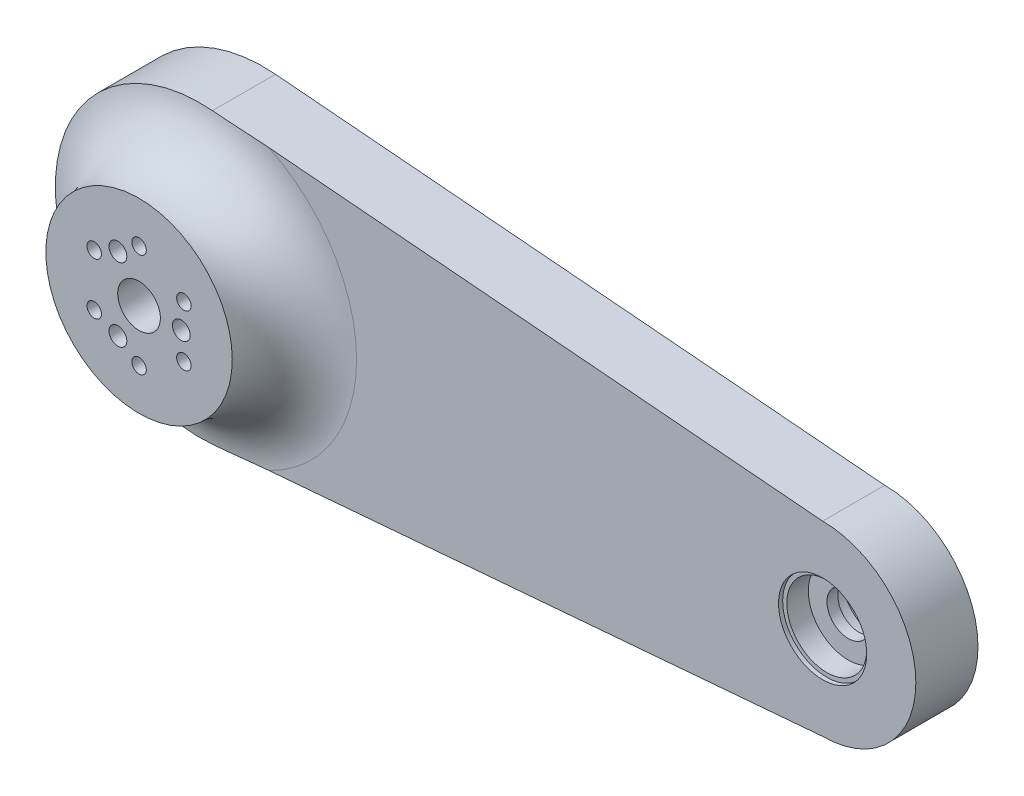
ISO-10303-21;
HEADER;
FILE_DESCRIPTION(('STEP AP214'),'2;1');
FILE_NAME('part.step','',(''),(''),'','','');
FILE_SCHEMA(('AUTOMOTIVE_DESIGN { 1 0 10303 214 1 1 1 1 }'));
ENDSEC;
DATA;
#1=APPLICATION_CONTEXT('core data for automotive mechanical design processes');
#2=APPLICATION_PROTOCOL_DEFINITION('international standard','automotive_design',2000,#1);
#3=PRODUCT_CONTEXT('',#1,'mechanical');
#4=PRODUCT('Part','Part','',(#3));
#5=PRODUCT_RELATED_PRODUCT_CATEGORY('part','',(#4));
#6=PRODUCT_DEFINITION_FORMATION('','',#4);
#7=PRODUCT_DEFINITION_CONTEXT('part definition',#1,'design');
#8=PRODUCT_DEFINITION('design','',#6,#7);
#9=PRODUCT_DEFINITION_SHAPE('','',#8);
#10=(LENGTH_UNIT() NAMED_UNIT(*) SI_UNIT(.MILLI.,.METRE.));
#11=(NAMED_UNIT(*) PLANE_ANGLE_UNIT() SI_UNIT($,.RADIAN.));
#12=(NAMED_UNIT(*) SI_UNIT($,.STERADIAN.) SOLID_ANGLE_UNIT());
#13=UNCERTAINTY_MEASURE_WITH_UNIT(LENGTH_MEASURE(1.E-05),#10,'distance_accuracy_value','');
#14=(GEOMETRIC_REPRESENTATION_CONTEXT(3) GLOBAL_UNCERTAINTY_ASSIGNED_CONTEXT((#13)) GLOBAL_UNIT_ASSIGNED_CONTEXT((#10,
#11,#12)) REPRESENTATION_CONTEXT('',''));
#15=CARTESIAN_POINT('',(0.,0.,0.));
#16=DIRECTION('',(0.,0.,1.));
#17=DIRECTION('',(1.,0.,0.));
#18=AXIS2_PLACEMENT_3D('',#15,#16,#17);
#19=CARTESIAN_POINT('',(0.,0.,30.));
#20=DIRECTION('',(0.,0.,1.));
#21=DIRECTION('',(1.,0.,0.));
#22=AXIS2_PLACEMENT_3D('',#19,#20,#21);
#23=PLANE('',#22);
#24=CARTESIAN_POINT('',(-5.1,-8.833459118601,30.));
#25=DIRECTION('',(0.,0.,-1.));
#26=DIRECTION('',(-1.,0.,0.));
#27=AXIS2_PLACEMENT_3D('',#24,#25,#26);
#28=CIRCLE('',#27,2.15000000000001);
#29=CARTESIAN_POINT('',(-7.25000000000001,-8.833459118601,30.));
#30=VERTEX_POINT('',#29);
#31=EDGE_CURVE('E835',#30,#30,#28,.T.);
#32=ORIENTED_EDGE('',*,*,#31,.T.);
#33=EDGE_LOOP('',(#32));
#34=FACE_BOUND('',#33,.T.);
#35=CARTESIAN_POINT('',(0.,0.,30.));
#36=DIRECTION('',(0.,0.,1.));
#37=DIRECTION('',(1.,0.,0.));
#38=AXIS2_PLACEMENT_3D('',#35,#36,#37);
#39=CIRCLE('',#38,22.49999999897);
#40=CARTESIAN_POINT('',(22.49999999897,0.,30.));
#41=VERTEX_POINT('',#40);
#42=EDGE_CURVE('E166',#41,#41,#39,.T.);
#43=ORIENTED_EDGE('',*,*,#42,.T.);
#44=EDGE_LOOP('',(#43));
#45=FACE_BOUND('',#44,.T.);
#46=CARTESIAN_POINT('',(0.,0.,30.));
#47=DIRECTION('',(0.,0.,1.));
#48=DIRECTION('',(1.,0.,0.));
#49=AXIS2_PLACEMENT_3D('',#46,#47,#48);
#50=CIRCLE('',#49,5.15000000000001);
#51=CARTESIAN_POINT('',(5.15000000000001,0.,30.));
#52=VERTEX_POINT('',#51);
#53=EDGE_CURVE('E926',#52,#52,#50,.T.);
#54=ORIENTED_EDGE('',*,*,#53,.F.);
#55=EDGE_LOOP('',(#54));
#56=FACE_BOUND('',#55,.T.);
#57=CARTESIAN_POINT('',(0.,-12.5,30.));
#58=DIRECTION('',(0.,0.,-1.));
#59=DIRECTION('',(-1.,0.,0.));
#60=AXIS2_PLACEMENT_3D('',#57,#58,#59);
#61=CIRCLE('',#60,1.75000000000001);
#62=CARTESIAN_POINT('',(-1.75000000000001,-12.5,30.));
#63=VERTEX_POINT('',#62);
#64=EDGE_CURVE('E923',#63,#63,#61,.T.);
#65=ORIENTED_EDGE('',*,*,#64,.T.);
#66=EDGE_LOOP('',(#65));
#67=FACE_BOUND('',#66,.T.);
#68=CARTESIAN_POINT('',(-10.82531754731,-6.25,30.));
#69=DIRECTION('',(0.,0.,-1.));
#70=DIRECTION('',(-1.,0.,0.));
#71=AXIS2_PLACEMENT_3D('',#68,#69,#70);
#72=CIRCLE('',#71,1.75000000000001);
#73=CARTESIAN_POINT('',(-12.57531754731,-6.25,30.));
#74=VERTEX_POINT('',#73);
#75=EDGE_CURVE('E911',#74,#74,#72,.T.);
#76=ORIENTED_EDGE('',*,*,#75,.T.);
#77=EDGE_LOOP('',(#76));
#78=FACE_BOUND('',#77,.T.);
#79=CARTESIAN_POINT('',(10.82531754731,-6.25,30.));
#80=DIRECTION('',(0.,0.,-1.));
#81=DIRECTION('',(-1.,0.,0.));
#82=AXIS2_PLACEMENT_3D('',#79,#80,#81);
#83=CIRCLE('',#82,1.75000000000001);
#84=CARTESIAN_POINT('',(9.07531754730999,-6.25,30.));
#85=VERTEX_POINT('',#84);
#86=EDGE_CURVE('E899',#85,#85,#83,.T.);
#87=ORIENTED_EDGE('',*,*,#86,.T.);
#88=EDGE_LOOP('',(#87));
#89=FACE_BOUND('',#88,.T.);
#90=CARTESIAN_POINT('',(10.82531754731,6.25,30.));
#91=DIRECTION('',(0.,0.,-1.));
#92=DIRECTION('',(-1.,0.,0.));
#93=AXIS2_PLACEMENT_3D('',#90,#91,#92);
#94=CIRCLE('',#93,1.75000000000001);
#95=CARTESIAN_POINT('',(9.07531754730999,6.25,30.));
#96=VERTEX_POINT('',#95);
#97=EDGE_CURVE('E887',#96,#96,#94,.T.);
#98=ORIENTED_EDGE('',*,*,#97,.T.);
#99=EDGE_LOOP('',(#98));
#100=FACE_BOUND('',#99,.T.);
#101=CARTESIAN_POINT('',(0.,12.5,30.));
#102=DIRECTION('',(0.,0.,-1.));
#103=DIRECTION('',(-1.,0.,0.));
#104=AXIS2_PLACEMENT_3D('',#101,#102,#103);
#105=CIRCLE('',#104,1.75000000000001);
#106=CARTESIAN_POINT('',(-1.75000000000001,12.5,30.));
#107=VERTEX_POINT('',#106);
#108=EDGE_CURVE('E875',#107,#107,#105,.T.);
#109=ORIENTED_EDGE('',*,*,#108,.T.);
#110=EDGE_LOOP('',(#109));
#111=FACE_BOUND('',#110,.T.);
#112=CARTESIAN_POINT('',(-10.82531754731,6.25,30.));
#113=DIRECTION('',(0.,0.,-1.));
#114=DIRECTION('',(-1.,0.,0.));
#115=AXIS2_PLACEMENT_3D('',#112,#113,#114);
#116=CIRCLE('',#115,1.75000000000001);
#117=CARTESIAN_POINT('',(-12.57531754731,6.25,30.));
#118=VERTEX_POINT('',#117);
#119=EDGE_CURVE('E863',#118,#118,#116,.T.);
#120=ORIENTED_EDGE('',*,*,#119,.T.);
#121=EDGE_LOOP('',(#120));
#122=FACE_BOUND('',#121,.T.);
#123=CARTESIAN_POINT('',(-5.1,8.833459118601,30.));
#124=DIRECTION('',(0.,0.,-1.));
#125=DIRECTION('',(-1.,0.,0.));
#126=AXIS2_PLACEMENT_3D('',#123,#124,#125);
#127=CIRCLE('',#126,2.15000000000001);
#128=CARTESIAN_POINT('',(-7.25000000000001,8.833459118601,30.));
#129=VERTEX_POINT('',#128);
#130=EDGE_CURVE('E851',#129,#129,#127,.T.);
#131=ORIENTED_EDGE('',*,*,#130,.T.);
#132=EDGE_LOOP('',(#131));
#133=FACE_BOUND('',#132,.T.);
#134=CARTESIAN_POINT('',(10.2,0.,30.));
#135=DIRECTION('',(0.,0.,-1.));
#136=DIRECTION('',(-1.,0.,0.));
#137=AXIS2_PLACEMENT_3D('',#134,#135,#136);
#138=CIRCLE('',#137,2.15000000000001);
#139=CARTESIAN_POINT('',(8.04999999999999,0.,30.));
#140=VERTEX_POINT('',#139);
#141=EDGE_CURVE('E845',#140,#140,#138,.T.);
#142=ORIENTED_EDGE('',*,*,#141,.T.);
#143=EDGE_LOOP('',(#142));
#144=FACE_BOUND('',#143,.T.);
#145=ADVANCED_FACE('F43',(#34,#45,#56,#67,#78,#89,#100,#111,#122,#133,#144),#23,.T.);
#146=CARTESIAN_POINT('',(0.,0.,0.));
#147=DIRECTION('',(0.,0.,1.));
#148=DIRECTION('',(1.,0.,0.));
#149=AXIS2_PLACEMENT_3D('',#146,#147,#148);
#150=PLANE('',#149);
#151=CARTESIAN_POINT('',(-5.1,-8.833459118601,0.));
#152=DIRECTION('',(0.,0.,-1.));
#153=DIRECTION('',(-1.,0.,0.));
#154=AXIS2_PLACEMENT_3D('',#151,#152,#153);
#155=CIRCLE('',#154,2.15000000000001);
#156=CARTESIAN_POINT('',(-7.25000000000002,-8.833459118601,0.));
#157=VERTEX_POINT('',#156);
#158=EDGE_CURVE('E838',#157,#157,#155,.T.);
#159=ORIENTED_EDGE('',*,*,#158,.F.);
#160=EDGE_LOOP('',(#159));
#161=FACE_BOUND('',#160,.T.);
#162=CARTESIAN_POINT('',(10.2,0.,0.));
#163=DIRECTION('',(0.,0.,-1.));
#164=DIRECTION('',(-1.,0.,0.));
#165=AXIS2_PLACEMENT_3D('',#162,#163,#164);
#166=CIRCLE('',#165,2.15000000000001);
#167=CARTESIAN_POINT('',(8.04999999999999,0.,0.));
#168=VERTEX_POINT('',#167);
#169=EDGE_CURVE('E840',#168,#168,#166,.T.);
#170=ORIENTED_EDGE('',*,*,#169,.F.);
#171=EDGE_LOOP('',(#170));
#172=FACE_BOUND('',#171,.T.);
#173=CARTESIAN_POINT('',(-5.1,8.833459118601,0.));
#174=DIRECTION('',(0.,0.,-1.));
#175=DIRECTION('',(-1.,0.,0.));
#176=AXIS2_PLACEMENT_3D('',#173,#174,#175);
#177=CIRCLE('',#176,2.15000000000001);
#178=CARTESIAN_POINT('',(-7.25000000000002,8.833459118601,0.));
#179=VERTEX_POINT('',#178);
#180=EDGE_CURVE('E848',#179,#179,#177,.T.);
#181=ORIENTED_EDGE('',*,*,#180,.F.);
#182=EDGE_LOOP('',(#181));
#183=FACE_BOUND('',#182,.T.);
#184=CARTESIAN_POINT('',(-10.82531754731,6.25,0.));
#185=DIRECTION('',(0.,0.,-1.));
#186=DIRECTION('',(-1.,0.,0.));
#187=AXIS2_PLACEMENT_3D('',#184,#185,#186);
#188=CIRCLE('',#187,3.25000000000001);
#189=CARTESIAN_POINT('',(-14.07531754731,6.25,0.));
#190=VERTEX_POINT('',#189);
#191=EDGE_CURVE('E854',#190,#190,#188,.T.);
#192=ORIENTED_EDGE('',*,*,#191,.F.);
#193=EDGE_LOOP('',(#192));
#194=FACE_BOUND('',#193,.T.);
#195=CARTESIAN_POINT('',(0.,12.5,0.));
#196=DIRECTION('',(0.,0.,-1.));
#197=DIRECTION('',(-1.,0.,0.));
#198=AXIS2_PLACEMENT_3D('',#195,#196,#197);
#199=CIRCLE('',#198,3.25000000000001);
#200=CARTESIAN_POINT('',(-3.25000000000001,12.5,0.));
#201=VERTEX_POINT('',#200);
#202=EDGE_CURVE('E866',#201,#201,#199,.T.);
#203=ORIENTED_EDGE('',*,*,#202,.F.);
#204=EDGE_LOOP('',(#203));
#205=FACE_BOUND('',#204,.T.);
#206=CARTESIAN_POINT('',(10.82531754731,6.25,0.));
#207=DIRECTION('',(0.,0.,-1.));
#208=DIRECTION('',(-1.,0.,0.));
#209=AXIS2_PLACEMENT_3D('',#206,#207,#208);
#210=CIRCLE('',#209,3.25000000000001);
#211=CARTESIAN_POINT('',(7.57531754730999,6.25,0.));
#212=VERTEX_POINT('',#211);
#213=EDGE_CURVE('E878',#212,#212,#210,.T.);
#214=ORIENTED_EDGE('',*,*,#213,.F.);
#215=EDGE_LOOP('',(#214));
#216=FACE_BOUND('',#215,.T.);
#217=CARTESIAN_POINT('',(10.82531754731,-6.25,0.));
#218=DIRECTION('',(0.,0.,-1.));
#219=DIRECTION('',(-1.,0.,0.));
#220=AXIS2_PLACEMENT_3D('',#217,#218,#219);
#221=CIRCLE('',#220,3.25000000000001);
#222=CARTESIAN_POINT('',(7.57531754730999,-6.25,0.));
#223=VERTEX_POINT('',#222);
#224=EDGE_CURVE('E890',#223,#223,#221,.T.);
#225=ORIENTED_EDGE('',*,*,#224,.F.);
#226=EDGE_LOOP('',(#225));
#227=FACE_BOUND('',#226,.T.);
#228=CARTESIAN_POINT('',(-10.82531754731,-6.25,0.));
#229=DIRECTION('',(0.,0.,-1.));
#230=DIRECTION('',(-1.,0.,0.));
#231=AXIS2_PLACEMENT_3D('',#228,#229,#230);
#232=CIRCLE('',#231,3.25000000000001);
#233=CARTESIAN_POINT('',(-14.07531754731,-6.25,0.));
#234=VERTEX_POINT('',#233);
#235=EDGE_CURVE('E902',#234,#234,#232,.T.);
#236=ORIENTED_EDGE('',*,*,#235,.F.);
#237=EDGE_LOOP('',(#236));
#238=FACE_BOUND('',#237,.T.);
#239=CARTESIAN_POINT('',(0.,0.,0.));
#240=DIRECTION('',(0.,0.,1.));
#241=DIRECTION('',(1.,0.,0.));
#242=AXIS2_PLACEMENT_3D('',#239,#240,#241);
#243=CIRCLE('',#242,5.15000000000001);
#244=CARTESIAN_POINT('',(5.15000000000001,0.,0.));
#245=VERTEX_POINT('',#244);
#246=EDGE_CURVE('E929',#245,#245,#243,.T.);
#247=ORIENTED_EDGE('',*,*,#246,.T.);
#248=EDGE_LOOP('',(#247));
#249=FACE_BOUND('',#248,.T.);
#250=CARTESIAN_POINT('',(150.,0.,0.));
#251=DIRECTION('',(0.,0.,-1.));
#252=DIRECTION('',(-1.,0.,0.));
#253=AXIS2_PLACEMENT_3D('',#250,#251,#252);
#254=CIRCLE('',#253,10.65);
#255=CARTESIAN_POINT('',(139.35,0.,0.));
#256=VERTEX_POINT('',#255);
#257=EDGE_CURVE('E955',#256,#256,#254,.T.);
#258=ORIENTED_EDGE('',*,*,#257,.F.);
#259=EDGE_LOOP('',(#258));
#260=FACE_BOUND('',#259,.T.);
#261=CARTESIAN_POINT('',(0.,0.,0.));
#262=DIRECTION('',(0.,0.,-1.));
#263=DIRECTION('',(1.,0.,0.));
#264=AXIS2_PLACEMENT_3D('',#261,#262,#263);
#265=CIRCLE('',#264,34.9999999999974);
#266=CARTESIAN_POINT('',(2.9351603096,-34.87670904711,0.));
#267=VERTEX_POINT('',#266);
#268=CARTESIAN_POINT('',(2.9351603096,34.87670904711,0.));
#269=VERTEX_POINT('',#268);
#270=EDGE_CURVE('E105',#267,#269,#265,.T.);
#271=ORIENTED_EDGE('',*,*,#270,.T.);
#272=DIRECTION('',(0.996477401346075,-0.083861723131435,0.));
#273=VECTOR('',#272,1.);
#274=CARTESIAN_POINT('',(149.999999999946,22.5,0.));
#275=LINE('',#274,#273);
#276=CARTESIAN_POINT('',(149.999999999946,22.5,0.));
#277=VERTEX_POINT('',#276);
#278=EDGE_CURVE('E111',#269,#277,#275,.T.);
#279=ORIENTED_EDGE('',*,*,#278,.T.);
#280=CARTESIAN_POINT('',(149.999999999946,0.,0.));
#281=DIRECTION('',(0.,0.,-1.));
#282=DIRECTION('',(1.,0.,0.));
#283=AXIS2_PLACEMENT_3D('',#280,#281,#282);
#284=CIRCLE('',#283,22.5);
#285=CARTESIAN_POINT('',(149.999999999946,-22.5,0.));
#286=VERTEX_POINT('',#285);
#287=EDGE_CURVE('E117',#277,#286,#284,.T.);
#288=ORIENTED_EDGE('',*,*,#287,.T.);
#289=DIRECTION('',(-0.996477401346075,-0.0838617231314349,0.));
#290=VECTOR('',#289,1.);
#291=CARTESIAN_POINT('',(2.9351603096,-34.87670904711,0.));
#292=LINE('',#291,#290);
#293=EDGE_CURVE('E123',#286,#267,#292,.T.);
#294=ORIENTED_EDGE('',*,*,#293,.T.);
#295=EDGE_LOOP('',(#271,#279,#288,#294));
#296=FACE_BOUND('',#295,.T.);
#297=CARTESIAN_POINT('',(0.,-12.5,0.));
#298=DIRECTION('',(0.,0.,-1.));
#299=DIRECTION('',(-1.,0.,0.));
#300=AXIS2_PLACEMENT_3D('',#297,#298,#299);
#301=CIRCLE('',#300,3.25000000000001);
#302=CARTESIAN_POINT('',(-3.25000000000001,-12.5,0.));
#303=VERTEX_POINT('',#302);
#304=EDGE_CURVE('E914',#303,#303,#301,.T.);
#305=ORIENTED_EDGE('',*,*,#304,.F.);
#306=EDGE_LOOP('',(#305));
#307=FACE_BOUND('',#306,.T.);
#308=ADVANCED_FACE('F120',(#161,#172,#183,#194,#205,#216,#227,#238,#249,#260,#296,#307),#150,.F.);
#309=CARTESIAN_POINT('',(150.,-22.5,0.));
#310=DIRECTION('',(0.083861723131418,-0.996477401346076,0.));
#311=DIRECTION('',(0.,0.,-1.));
#312=AXIS2_PLACEMENT_3D('',#309,#310,#311);
#313=PLANE('',#312);
#314=DIRECTION('',(0.,0.,1.));
#315=VECTOR('',#314,1.);
#316=CARTESIAN_POINT('',(2.9351603096,-34.87670904711,0.));
#317=LINE('',#316,#315);
#318=CARTESIAN_POINT('',(2.9351603096,-34.87670904711,15.20980054202));
#319=VERTEX_POINT('',#318);
#320=EDGE_CURVE('E12',#267,#319,#317,.T.);
#321=ORIENTED_EDGE('',*,*,#320,.F.);
#322=ORIENTED_EDGE('',*,*,#293,.F.);
#323=DIRECTION('',(0.,0.,1.));
#324=VECTOR('',#323,1.);
#325=CARTESIAN_POINT('',(149.999999999946,-22.5,0.));
#326=LINE('',#325,#324);
#327=CARTESIAN_POINT('',(149.999999999946,-22.5,15.));
#328=VERTEX_POINT('',#327);
#329=EDGE_CURVE('E135',#286,#328,#326,.T.);
#330=ORIENTED_EDGE('',*,*,#329,.T.);
#331=DIRECTION('',(-0.996477401346075,-0.0838617231314349,0.));
#332=VECTOR('',#331,1.);
#333=CARTESIAN_POINT('',(2.9351603096,-34.87670904711,15.));
#334=LINE('',#333,#332);
#335=CARTESIAN_POINT('',(16.3506478879107,-33.7476860472472,15.));
#336=VERTEX_POINT('',#335);
#337=EDGE_CURVE('E124',#328,#336,#334,.T.);
#338=ORIENTED_EDGE('',*,*,#337,.T.);
#339=CARTESIAN_POINT('',(16.3506478879166,-33.7476860472467,15.));
#340=DIRECTION('',(-0.996477401346074,-0.083861723131451,0.));
#341=VECTOR('',#340,1.);
#342=LINE('',#339,#341);
#343=CARTESIAN_POINT('',(16.1341249488143,-33.7659064881683,15.000054430742));
#344=VERTEX_POINT('',#343);
#345=EDGE_CURVE('E84',#336,#344,#342,.T.);
#346=ORIENTED_EDGE('',*,*,#345,.T.);
#347=CARTESIAN_POINT('',(2.93516030960012,-34.8767090471102,15.2098005420215));
#348=CARTESIAN_POINT('',(3.20993583556304,-34.8535819390594,15.2098060816167));
#349=CARTESIAN_POINT('',(3.48471085233046,-34.8304502959314,15.2092515238699));
#350=CARTESIAN_POINT('',(4.03417296152801,-34.7841954888364,15.2070574950802));
#351=CARTESIAN_POINT('',(4.30886005523485,-34.7610723244336,15.2054183547048));
#352=CARTESIAN_POINT('',(4.85845282993849,-34.7148189005165,15.2010886227305));
#353=CARTESIAN_POINT('',(5.13335850488164,-34.6916886508114,15.1983971673582));
#354=CARTESIAN_POINT('',(5.70170632443045,-34.643872475381,15.1918214416084));
#355=CARTESIAN_POINT('',(5.99514770292789,-34.6191868813887,15.1878689442333));
#356=CARTESIAN_POINT('',(6.5449781253515,-34.5729126556728,15.1795341376359));
#357=CARTESIAN_POINT('',(6.8013691700996,-34.5513263855863,15.1752690402152));
#358=CARTESIAN_POINT('',(7.33234678517932,-34.5066245379097,15.1657539125237));
#359=CARTESIAN_POINT('',(7.60693250454309,-34.4835092183102,15.1604554468383));
#360=CARTESIAN_POINT('',(8.15667954319829,-34.4372418657766,15.1492373471155));
#361=CARTESIAN_POINT('',(8.43184083788909,-34.4140898600198,15.1433164091499));
#362=CARTESIAN_POINT('',(9.01915835707134,-34.3646790535521,15.1302095188456));
#363=CARTESIAN_POINT('',(9.33131323776626,-34.3384211660397,15.1229605282351));
#364=CARTESIAN_POINT('',(9.88173611353337,-34.2920973458742,15.1099341985514));
#365=CARTESIAN_POINT('',(10.1200059471297,-34.2720367665586,15.1042146080907));
#366=CARTESIAN_POINT('',(10.6328014613917,-34.2288646267811,15.0918793960185));
#367=CARTESIAN_POINT('',(10.9073270692681,-34.2057533001336,15.0852598622818));
#368=CARTESIAN_POINT('',(11.4571167897191,-34.1594809604264,15.0722003894579));
#369=CARTESIAN_POINT('',(11.7323809175471,-34.1363199794106,15.0657609769273));
#370=CARTESIAN_POINT('',(12.3381548566618,-34.0853570727704,15.0520818595039));
#371=CARTESIAN_POINT('',(12.6686670657319,-34.0575564460771,15.0449408422918));
#372=CARTESIAN_POINT('',(13.2193684357758,-34.0112077575313,15.0339634135615));
#373=CARTESIAN_POINT('',(13.4395522209701,-33.9926692024221,15.0298196569733));
#374=CARTESIAN_POINT('',(13.9339670914104,-33.9510413524007,15.0212244816025));
#375=CARTESIAN_POINT('',(14.2082012331127,-33.9279517552704,15.0169471180223));
#376=CARTESIAN_POINT('',(14.7573044733985,-33.8817329261604,15.0096483395454));
#377=CARTESIAN_POINT('',(15.0321736136279,-33.8586037217536,15.0066297694107));
#378=CARTESIAN_POINT('',(15.5827353356565,-33.8122818360614,15.0021570418202));
#379=CARTESIAN_POINT('',(15.8584279554722,-33.7890891687177,15.0007075238416));
#380=CARTESIAN_POINT('',(16.1341241660468,-33.7658950486008,15.0002000630099));
#381=B_SPLINE_CURVE_WITH_KNOTS('',3,(#347,#348,#349,#350,#351,#352,#353,#354,#355,#356,#357,
#358,#359,#360,#361,#362,#363,#364,#365,#366,#367,#368,#369,#370,#371,#372,#373,#374,#375,#376,
#377,#378,#379,#380),.UNSPECIFIED.,.F.,.F.,(4,2,2,2,2,2,2,2,2,2,2,2,2,2,2,2,4),(0.,
0.827240479870693,1.65422886685951,2.48189750197141,3.36540875506361,4.13740830255337,
4.96423109240559,5.79282175354288,6.73284499397904,7.45038865232439,8.27711732999443,
9.10605279197495,10.1013201367672,10.7643245555658,11.5900355118842,12.4176025199414,
13.2476099043412),.UNSPECIFIED.);
#382=EDGE_CURVE('E80',#319,#344,#381,.T.);
#383=ORIENTED_EDGE('',*,*,#382,.F.);
#384=EDGE_LOOP('',(#321,#322,#330,#338,#346,#383));
#385=FACE_BOUND('',#384,.T.);
#386=ADVANCED_FACE('F404',(#385),#313,.T.);
#387=CARTESIAN_POINT('',(0.,0.,0.));
#388=DIRECTION('',(0.,0.,-1.));
#389=DIRECTION('',(1.,0.,0.));
#390=AXIS2_PLACEMENT_3D('',#387,#388,#389);
#391=CYLINDRICAL_SURFACE('',#390,35.);
#392=DIRECTION('',(0.,0.,1.));
#393=VECTOR('',#392,1.);
#394=CARTESIAN_POINT('',(2.9351603096,34.87670904711,0.));
#395=LINE('',#394,#393);
#396=CARTESIAN_POINT('',(2.9351603096,34.87670904711,15.20980054208));
#397=VERTEX_POINT('',#396);
#398=EDGE_CURVE('E56',#269,#397,#395,.T.);
#399=ORIENTED_EDGE('',*,*,#398,.F.);
#400=ORIENTED_EDGE('',*,*,#270,.F.);
#401=ORIENTED_EDGE('',*,*,#320,.T.);
#402=CARTESIAN_POINT('',(0.,0.,15.20980054202));
#403=DIRECTION('',(0.,0.,1.));
#404=DIRECTION('',(-0.999999999999208,-1.25838177712501E-06,0.));
#405=AXIS2_PLACEMENT_3D('',#402,#403,#404);
#406=CIRCLE('',#405,35.);
#407=EDGE_CURVE('E106',#397,#319,#406,.T.);
#408=ORIENTED_EDGE('',*,*,#407,.F.);
#409=EDGE_LOOP('',(#399,#400,#401,#408));
#410=FACE_BOUND('',#409,.T.);
#411=ADVANCED_FACE('F45',(#410),#391,.T.);
#412=CARTESIAN_POINT('',(2.9351603096,34.87670904711,0.));
#413=DIRECTION('',(0.083861723131418,0.996477401346076,0.));
#414=DIRECTION('',(0.,0.,-1.));
#415=AXIS2_PLACEMENT_3D('',#412,#413,#414);
#416=PLANE('',#415);
#417=CARTESIAN_POINT('',(16.1341231185345,33.7658825997035,15.0002001233611));
#418=CARTESIAN_POINT('',(15.858445750578,33.7890755298413,15.0007076322225));
#419=CARTESIAN_POINT('',(15.5827720254092,33.8122676319499,15.0021570413608));
#420=CARTESIAN_POINT('',(15.0322374578887,33.8585898576909,15.006629385798));
#421=CARTESIAN_POINT('',(14.757376577885,33.8817199658961,15.0096477430827));
#422=CARTESIAN_POINT('',(14.2082793767812,33.9279413862148,15.0169461316344));
#423=CARTESIAN_POINT('',(13.9340430147632,33.9510326714302,15.0212233665522));
#424=CARTESIAN_POINT('',(13.4396215795634,33.9926627370956,15.0298184214799));
#425=CARTESIAN_POINT('',(13.2194334670994,34.0112020239449,15.0339621798909));
#426=CARTESIAN_POINT('',(12.6687288499914,34.0575516374305,15.0449395166113));
#427=CARTESIAN_POINT('',(12.3382177099509,34.0853523249089,15.0520804420868));
#428=CARTESIAN_POINT('',(11.7324445547616,34.1363157441185,15.065759406203));
#429=CARTESIAN_POINT('',(11.457180137721,34.1594771267793,15.0721987611625));
#430=CARTESIAN_POINT('',(10.9073849745973,34.2057503838651,15.0852582726017));
#431=CARTESIAN_POINT('',(10.6328542134244,34.2288622272307,15.0918779058967));
#432=CARTESIAN_POINT('',(10.1200484467416,34.2720344836415,15.1042134396839));
#433=CARTESIAN_POINT('',(9.88177352358262,34.2920947811021,15.109933236078));
#434=CARTESIAN_POINT('',(9.33135560763044,34.3384168349471,15.1229596265768));
#435=CARTESIAN_POINT('',(9.01921078417487,34.3646733291487,15.1302084807193));
#436=CARTESIAN_POINT('',(8.43190572065417,34.4140831524176,15.1433151627441));
#437=CARTESIAN_POINT('',(8.15674681359736,34.4372354396366,15.1492360300275));
#438=CARTESIAN_POINT('',(7.60699566613171,34.4835040994892,15.1604541823239));
#439=CARTESIAN_POINT('',(7.33240344995129,34.5066204453609,15.1657527515385));
#440=CARTESIAN_POINT('',(6.80140689575371,34.5513239720185,15.175268292064));
#441=CARTESIAN_POINT('',(6.54500341297488,34.5729109503486,15.1795336759831));
#442=CARTESIAN_POINT('',(5.99516411814132,34.6191850153004,15.1878687851068));
#443=CARTESIAN_POINT('',(5.70172630395495,34.6438697154913,15.1918213526593));
#444=CARTESIAN_POINT('',(5.13338317062805,34.6916851062261,15.1983971480449));
#445=CARTESIAN_POINT('',(4.85847861357872,34.7148154173837,15.2010886006205));
#446=CARTESIAN_POINT('',(4.30888434829428,34.7610693874161,15.2054183458964));
#447=CARTESIAN_POINT('',(4.03419464600535,34.7841930365559,15.207057488107));
#448=CARTESIAN_POINT('',(3.48472357376745,34.8304490337886,15.2092515305827));
#449=CARTESIAN_POINT('',(3.20994220248224,34.8535813823069,15.2098060854185));
#450=CARTESIAN_POINT('',(2.93516030957228,34.8767090467807,15.2098005420774));
#451=B_SPLINE_CURVE_WITH_KNOTS('',3,(#417,#418,#419,#420,#421,#422,#423,#424,#425,#426,#427,
#428,#429,#430,#431,#432,#433,#434,#435,#436,#437,#438,#439,#440,#441,#442,#443,#444,#445,#446,
#447,#448,#449,#450),.UNSPECIFIED.,.F.,.F.,(4,2,2,2,2,2,2,2,2,2,2,2,2,2,2,2,4),(0.,
0.829950757754909,1.65749329484545,2.4832113065327,3.14622884317493,4.14149300221812,
4.97042942552221,5.79717364130421,6.51473245405242,7.45472527716003,8.2833088683115,
9.11015134071257,9.88218825826344,10.7656886349376,11.5933539434023,12.420350250444,
13.2476099039985),.UNSPECIFIED.);
#452=CARTESIAN_POINT('',(16.1341248100189,33.7659047821738,15.0000556357053));
#453=VERTEX_POINT('',#452);
#454=EDGE_CURVE('E146',#453,#397,#451,.T.);
#455=ORIENTED_EDGE('',*,*,#454,.F.);
#456=CARTESIAN_POINT('',(16.1341250985679,33.7659082108256,15.));
#457=DIRECTION('',(0.996477401346076,-0.0838617231314189,0.));
#458=VECTOR('',#457,1.);
#459=LINE('',#456,#458);
#460=CARTESIAN_POINT('',(16.35064788883,33.74768604717,15.));
#461=VERTEX_POINT('',#460);
#462=EDGE_CURVE('E108',#453,#461,#459,.T.);
#463=ORIENTED_EDGE('',*,*,#462,.T.);
#464=DIRECTION('',(0.996477401346075,-0.083861723131435,0.));
#465=VECTOR('',#464,1.);
#466=CARTESIAN_POINT('',(149.999999999946,22.5,15.));
#467=LINE('',#466,#465);
#468=CARTESIAN_POINT('',(149.999999999946,22.5,15.));
#469=VERTEX_POINT('',#468);
#470=EDGE_CURVE('E140',#461,#469,#467,.T.);
#471=ORIENTED_EDGE('',*,*,#470,.T.);
#472=DIRECTION('',(0.,0.,1.));
#473=VECTOR('',#472,1.);
#474=CARTESIAN_POINT('',(149.999999999946,22.5,0.));
#475=LINE('',#474,#473);
#476=EDGE_CURVE('E114',#277,#469,#475,.T.);
#477=ORIENTED_EDGE('',*,*,#476,.F.);
#478=ORIENTED_EDGE('',*,*,#278,.F.);
#479=ORIENTED_EDGE('',*,*,#398,.T.);
#480=EDGE_LOOP('',(#455,#463,#471,#477,#478,#479));
#481=FACE_BOUND('',#480,.T.);
#482=ADVANCED_FACE('F112',(#481),#416,.T.);
#483=CARTESIAN_POINT('',(0.,0.,30.));
#484=DIRECTION('',(0.,0.,1.));
#485=DIRECTION('',(0.99995279255641,0.0097166176541511,0.));
#486=AXIS2_PLACEMENT_3D('',#483,#484,#485);
#487=TOROIDAL_SURFACE('',#486,37.49999999864,15.);
#488=ORIENTED_EDGE('',*,*,#42,.F.);
#489=EDGE_LOOP('',(#488));
#490=FACE_BOUND('',#489,.T.);
#491=ORIENTED_EDGE('',*,*,#462,.F.);
#492=ORIENTED_EDGE('',*,*,#454,.T.);
#493=ORIENTED_EDGE('',*,*,#407,.T.);
#494=ORIENTED_EDGE('',*,*,#382,.T.);
#495=ORIENTED_EDGE('',*,*,#345,.F.);
#496=CARTESIAN_POINT('',(0.,0.,15.));
#497=DIRECTION('',(0.,0.,1.));
#498=DIRECTION('',(0.436017277026993,-0.899938294625785,0.));
#499=AXIS2_PLACEMENT_3D('',#496,#497,#498);
#500=CIRCLE('',#499,37.49999999864);
#501=EDGE_CURVE('E143',#336,#461,#500,.T.);
#502=ORIENTED_EDGE('',*,*,#501,.T.);
#503=EDGE_LOOP('',(#491,#492,#493,#494,#495,#502));
#504=FACE_BOUND('',#503,.T.);
#505=ADVANCED_FACE('F191',(#490,#504),#487,.F.);
#506=CARTESIAN_POINT('',(149.999999999946,0.,0.));
#507=DIRECTION('',(0.,0.,1.));
#508=DIRECTION('',(1.,0.,0.));
#509=AXIS2_PLACEMENT_3D('',#506,#507,#508);
#510=CYLINDRICAL_SURFACE('',#509,22.5);
#511=CARTESIAN_POINT('',(149.999999999946,0.,15.));
#512=DIRECTION('',(0.,0.,-1.));
#513=DIRECTION('',(1.,0.,0.));
#514=AXIS2_PLACEMENT_3D('',#511,#512,#513);
#515=CIRCLE('',#514,22.5);
#516=EDGE_CURVE('E127',#469,#328,#515,.T.);
#517=ORIENTED_EDGE('',*,*,#516,.T.);
#518=ORIENTED_EDGE('',*,*,#329,.F.);
#519=ORIENTED_EDGE('',*,*,#287,.F.);
#520=ORIENTED_EDGE('',*,*,#476,.T.);
#521=EDGE_LOOP('',(#517,#518,#519,#520));
#522=FACE_BOUND('',#521,.T.);
#523=ADVANCED_FACE('F200',(#522),#510,.T.);
#524=CARTESIAN_POINT('',(0.,0.,15.));
#525=DIRECTION('',(0.,0.,1.));
#526=DIRECTION('',(1.,0.,0.));
#527=AXIS2_PLACEMENT_3D('',#524,#525,#526);
#528=PLANE('',#527);
#529=CARTESIAN_POINT('',(150.,0.,15.));
#530=DIRECTION('',(0.,0.,-1.));
#531=DIRECTION('',(-1.,0.,0.));
#532=AXIS2_PLACEMENT_3D('',#529,#530,#531);
#533=CIRCLE('',#532,10.65);
#534=CARTESIAN_POINT('',(139.35,0.,15.));
#535=VERTEX_POINT('',#534);
#536=EDGE_CURVE('E130',#535,#535,#533,.T.);
#537=ORIENTED_EDGE('',*,*,#536,.T.);
#538=EDGE_LOOP('',(#537));
#539=FACE_BOUND('',#538,.T.);
#540=ORIENTED_EDGE('',*,*,#470,.F.);
#541=ORIENTED_EDGE('',*,*,#501,.F.);
#542=ORIENTED_EDGE('',*,*,#337,.F.);
#543=ORIENTED_EDGE('',*,*,#516,.F.);
#544=EDGE_LOOP('',(#540,#541,#542,#543));
#545=FACE_BOUND('',#544,.T.);
#546=ADVANCED_FACE('F485',(#539,#545),#528,.T.);
#547=CARTESIAN_POINT('',(150.,0.,15.));
#548=DIRECTION('',(0.,0.,-1.));
#549=DIRECTION('',(-1.,0.,0.));
#550=AXIS2_PLACEMENT_3D('',#547,#548,#549);
#551=CYLINDRICAL_SURFACE('',#550,10.65);
#552=ORIENTED_EDGE('',*,*,#536,.F.);
#553=EDGE_LOOP('',(#552));
#554=FACE_BOUND('',#553,.T.);
#555=CARTESIAN_POINT('',(150.,0.,14.));
#556=DIRECTION('',(0.,0.,-1.));
#557=DIRECTION('',(-1.,0.,0.));
#558=AXIS2_PLACEMENT_3D('',#555,#556,#557);
#559=CIRCLE('',#558,10.65);
#560=CARTESIAN_POINT('',(139.35,0.,14.));
#561=VERTEX_POINT('',#560);
#562=EDGE_CURVE('E932',#561,#561,#559,.T.);
#563=ORIENTED_EDGE('',*,*,#562,.T.);
#564=EDGE_LOOP('',(#563));
#565=FACE_BOUND('',#564,.T.);
#566=ADVANCED_FACE('F493',(#554,#565),#551,.F.);
#567=CARTESIAN_POINT('',(150.,0.,15.));
#568=DIRECTION('',(0.,0.,-1.));
#569=DIRECTION('',(-1.,0.,0.));
#570=AXIS2_PLACEMENT_3D('',#567,#568,#569);
#571=CYLINDRICAL_SURFACE('',#570,10.65);
#572=CARTESIAN_POINT('',(150.,0.,1.));
#573=DIRECTION('',(0.,0.,-1.));
#574=DIRECTION('',(-1.,0.,0.));
#575=AXIS2_PLACEMENT_3D('',#572,#573,#574);
#576=CIRCLE('',#575,10.65);
#577=CARTESIAN_POINT('',(139.35,0.,1.));
#578=VERTEX_POINT('',#577);
#579=EDGE_CURVE('E953',#578,#578,#576,.T.);
#580=ORIENTED_EDGE('',*,*,#579,.F.);
#581=EDGE_LOOP('',(#580));
#582=FACE_BOUND('',#581,.T.);
#583=ORIENTED_EDGE('',*,*,#257,.T.);
#584=EDGE_LOOP('',(#583));
#585=FACE_BOUND('',#584,.T.);
#586=ADVANCED_FACE('F501',(#582,#585),#571,.F.);
#587=CARTESIAN_POINT('',(160.65,0.,1.));
#588=DIRECTION('',(0.,0.,1.));
#589=DIRECTION('',(1.,0.,0.));
#590=AXIS2_PLACEMENT_3D('',#587,#588,#589);
#591=PLANE('',#590);
#592=CARTESIAN_POINT('',(150.,0.,1.));
#593=DIRECTION('',(0.,0.,-1.));
#594=DIRECTION('',(-1.,0.,0.));
#595=AXIS2_PLACEMENT_3D('',#592,#593,#594);
#596=CIRCLE('',#595,9.64999999999999);
#597=CARTESIAN_POINT('',(140.35,0.,1.));
#598=VERTEX_POINT('',#597);
#599=EDGE_CURVE('E950',#598,#598,#596,.T.);
#600=ORIENTED_EDGE('',*,*,#599,.F.);
#601=EDGE_LOOP('',(#600));
#602=FACE_BOUND('',#601,.T.);
#603=ORIENTED_EDGE('',*,*,#579,.T.);
#604=EDGE_LOOP('',(#603));
#605=FACE_BOUND('',#604,.T.);
#606=ADVANCED_FACE('F510',(#602,#605),#591,.F.);
#607=CARTESIAN_POINT('',(150.,0.,15.));
#608=DIRECTION('',(0.,0.,-1.));
#609=DIRECTION('',(-1.,0.,0.));
#610=AXIS2_PLACEMENT_3D('',#607,#608,#609);
#611=CYLINDRICAL_SURFACE('',#610,9.64999999999999);
#612=CARTESIAN_POINT('',(150.,0.,6.2));
#613=DIRECTION('',(0.,0.,-1.));
#614=DIRECTION('',(-1.,0.,0.));
#615=AXIS2_PLACEMENT_3D('',#612,#613,#614);
#616=CIRCLE('',#615,9.64999999999999);
#617=CARTESIAN_POINT('',(140.35,0.,6.2));
#618=VERTEX_POINT('',#617);
#619=EDGE_CURVE('E947',#618,#618,#616,.T.);
#620=ORIENTED_EDGE('',*,*,#619,.F.);
#621=EDGE_LOOP('',(#620));
#622=FACE_BOUND('',#621,.T.);
#623=ORIENTED_EDGE('',*,*,#599,.T.);
#624=EDGE_LOOP('',(#623));
#625=FACE_BOUND('',#624,.T.);
#626=ADVANCED_FACE('F519',(#622,#625),#611,.F.);
#627=CARTESIAN_POINT('',(159.65,0.,6.2));
#628=DIRECTION('',(0.,0.,1.));
#629=DIRECTION('',(1.,0.,0.));
#630=AXIS2_PLACEMENT_3D('',#627,#628,#629);
#631=PLANE('',#630);
#632=CARTESIAN_POINT('',(150.,0.,6.2));
#633=DIRECTION('',(0.,0.,-1.));
#634=DIRECTION('',(-1.,0.,0.));
#635=AXIS2_PLACEMENT_3D('',#632,#633,#634);
#636=CIRCLE('',#635,5.14999999999999);
#637=CARTESIAN_POINT('',(144.85,0.,6.2));
#638=VERTEX_POINT('',#637);
#639=EDGE_CURVE('E944',#638,#638,#636,.T.);
#640=ORIENTED_EDGE('',*,*,#639,.F.);
#641=EDGE_LOOP('',(#640));
#642=FACE_BOUND('',#641,.T.);
#643=ORIENTED_EDGE('',*,*,#619,.T.);
#644=EDGE_LOOP('',(#643));
#645=FACE_BOUND('',#644,.T.);
#646=ADVANCED_FACE('F528',(#642,#645),#631,.F.);
#647=CARTESIAN_POINT('',(150.,0.,15.));
#648=DIRECTION('',(0.,0.,-1.));
#649=DIRECTION('',(-1.,0.,0.));
#650=AXIS2_PLACEMENT_3D('',#647,#648,#649);
#651=CYLINDRICAL_SURFACE('',#650,5.14999999999999);
#652=CARTESIAN_POINT('',(150.,0.,8.8));
#653=DIRECTION('',(0.,0.,-1.));
#654=DIRECTION('',(-1.,0.,0.));
#655=AXIS2_PLACEMENT_3D('',#652,#653,#654);
#656=CIRCLE('',#655,5.14999999999999);
#657=CARTESIAN_POINT('',(144.85,0.,8.8));
#658=VERTEX_POINT('',#657);
#659=EDGE_CURVE('E941',#658,#658,#656,.T.);
#660=ORIENTED_EDGE('',*,*,#659,.F.);
#661=EDGE_LOOP('',(#660));
#662=FACE_BOUND('',#661,.T.);
#663=ORIENTED_EDGE('',*,*,#639,.T.);
#664=EDGE_LOOP('',(#663));
#665=FACE_BOUND('',#664,.T.);
#666=ADVANCED_FACE('F537',(#662,#665),#651,.F.);
#667=CARTESIAN_POINT('',(155.15,0.,8.8));
#668=DIRECTION('',(0.,0.,-1.));
#669=DIRECTION('',(-1.,0.,0.));
#670=AXIS2_PLACEMENT_3D('',#667,#668,#669);
#671=PLANE('',#670);
#672=CARTESIAN_POINT('',(150.,0.,8.8));
#673=DIRECTION('',(0.,0.,-1.));
#674=DIRECTION('',(-1.,0.,0.));
#675=AXIS2_PLACEMENT_3D('',#672,#673,#674);
#676=CIRCLE('',#675,9.64999999999999);
#677=CARTESIAN_POINT('',(140.35,0.,8.8));
#678=VERTEX_POINT('',#677);
#679=EDGE_CURVE('E938',#678,#678,#676,.T.);
#680=ORIENTED_EDGE('',*,*,#679,.F.);
#681=EDGE_LOOP('',(#680));
#682=FACE_BOUND('',#681,.T.);
#683=ORIENTED_EDGE('',*,*,#659,.T.);
#684=EDGE_LOOP('',(#683));
#685=FACE_BOUND('',#684,.T.);
#686=ADVANCED_FACE('F546',(#682,#685),#671,.F.);
#687=CARTESIAN_POINT('',(150.,0.,15.));
#688=DIRECTION('',(0.,0.,-1.));
#689=DIRECTION('',(-1.,0.,0.));
#690=AXIS2_PLACEMENT_3D('',#687,#688,#689);
#691=CYLINDRICAL_SURFACE('',#690,9.64999999999999);
#692=CARTESIAN_POINT('',(150.,0.,14.));
#693=DIRECTION('',(0.,0.,-1.));
#694=DIRECTION('',(-1.,0.,0.));
#695=AXIS2_PLACEMENT_3D('',#692,#693,#694);
#696=CIRCLE('',#695,9.64999999999999);
#697=CARTESIAN_POINT('',(140.35,0.,14.));
#698=VERTEX_POINT('',#697);
#699=EDGE_CURVE('E935',#698,#698,#696,.T.);
#700=ORIENTED_EDGE('',*,*,#699,.F.);
#701=EDGE_LOOP('',(#700));
#702=FACE_BOUND('',#701,.T.);
#703=ORIENTED_EDGE('',*,*,#679,.T.);
#704=EDGE_LOOP('',(#703));
#705=FACE_BOUND('',#704,.T.);
#706=ADVANCED_FACE('F555',(#702,#705),#691,.F.);
#707=CARTESIAN_POINT('',(159.65,0.,14.));
#708=DIRECTION('',(0.,0.,-1.));
#709=DIRECTION('',(-1.,0.,0.));
#710=AXIS2_PLACEMENT_3D('',#707,#708,#709);
#711=PLANE('',#710);
#712=ORIENTED_EDGE('',*,*,#562,.F.);
#713=EDGE_LOOP('',(#712));
#714=FACE_BOUND('',#713,.T.);
#715=ORIENTED_EDGE('',*,*,#699,.T.);
#716=EDGE_LOOP('',(#715));
#717=FACE_BOUND('',#716,.T.);
#718=ADVANCED_FACE('F564',(#714,#717),#711,.F.);
#719=CARTESIAN_POINT('',(0.,0.,30.));
#720=DIRECTION('',(0.,0.,1.));
#721=DIRECTION('',(1.,0.,0.));
#722=AXIS2_PLACEMENT_3D('',#719,#720,#721);
#723=CYLINDRICAL_SURFACE('',#722,5.15000000000001);
#724=ORIENTED_EDGE('',*,*,#53,.T.);
#725=EDGE_LOOP('',(#724));
#726=FACE_BOUND('',#725,.T.);
#727=ORIENTED_EDGE('',*,*,#246,.F.);
#728=EDGE_LOOP('',(#727));
#729=FACE_BOUND('',#728,.T.);
#730=ADVANCED_FACE('F573',(#726,#729),#723,.F.);
#731=CARTESIAN_POINT('',(0.,-12.5,0.));
#732=DIRECTION('',(0.,0.,-1.));
#733=DIRECTION('',(-1.,0.,0.));
#734=AXIS2_PLACEMENT_3D('',#731,#732,#733);
#735=CYLINDRICAL_SURFACE('',#734,1.75000000000001);
#736=ORIENTED_EDGE('',*,*,#64,.F.);
#737=EDGE_LOOP('',(#736));
#738=FACE_BOUND('',#737,.T.);
#739=CARTESIAN_POINT('',(0.,-12.5,4.));
#740=DIRECTION('',(0.,0.,-1.));
#741=DIRECTION('',(-1.,0.,0.));
#742=AXIS2_PLACEMENT_3D('',#739,#740,#741);
#743=CIRCLE('',#742,1.75000000000001);
#744=CARTESIAN_POINT('',(-1.75000000000001,-12.5,4.));
#745=VERTEX_POINT('',#744);
#746=EDGE_CURVE('E920',#745,#745,#743,.T.);
#747=ORIENTED_EDGE('',*,*,#746,.T.);
#748=EDGE_LOOP('',(#747));
#749=FACE_BOUND('',#748,.T.);
#750=ADVANCED_FACE('F582',(#738,#749),#735,.F.);
#751=CARTESIAN_POINT('',(1.75000000000001,-12.5,4.));
#752=DIRECTION('',(0.,0.,1.));
#753=DIRECTION('',(1.,0.,0.));
#754=AXIS2_PLACEMENT_3D('',#751,#752,#753);
#755=PLANE('',#754);
#756=ORIENTED_EDGE('',*,*,#746,.F.);
#757=EDGE_LOOP('',(#756));
#758=FACE_BOUND('',#757,.T.);
#759=CARTESIAN_POINT('',(0.,-12.5,4.));
#760=DIRECTION('',(0.,0.,-1.));
#761=DIRECTION('',(-1.,0.,0.));
#762=AXIS2_PLACEMENT_3D('',#759,#760,#761);
#763=CIRCLE('',#762,3.25000000000001);
#764=CARTESIAN_POINT('',(-3.25000000000001,-12.5,4.));
#765=VERTEX_POINT('',#764);
#766=EDGE_CURVE('E917',#765,#765,#763,.T.);
#767=ORIENTED_EDGE('',*,*,#766,.T.);
#768=EDGE_LOOP('',(#767));
#769=FACE_BOUND('',#768,.T.);
#770=ADVANCED_FACE('F601',(#758,#769),#755,.F.);
#771=CARTESIAN_POINT('',(0.,-12.5,0.));
#772=DIRECTION('',(0.,0.,-1.));
#773=DIRECTION('',(-1.,0.,0.));
#774=AXIS2_PLACEMENT_3D('',#771,#772,#773);
#775=CYLINDRICAL_SURFACE('',#774,3.25000000000001);
#776=ORIENTED_EDGE('',*,*,#766,.F.);
#777=EDGE_LOOP('',(#776));
#778=FACE_BOUND('',#777,.T.);
#779=ORIENTED_EDGE('',*,*,#304,.T.);
#780=EDGE_LOOP('',(#779));
#781=FACE_BOUND('',#780,.T.);
#782=ADVANCED_FACE('F610',(#778,#781),#775,.F.);
#783=CARTESIAN_POINT('',(-10.82531754731,-6.25,0.));
#784=DIRECTION('',(0.,0.,-1.));
#785=DIRECTION('',(-1.,0.,0.));
#786=AXIS2_PLACEMENT_3D('',#783,#784,#785);
#787=CYLINDRICAL_SURFACE('',#786,1.75000000000001);
#788=ORIENTED_EDGE('',*,*,#75,.F.);
#789=EDGE_LOOP('',(#788));
#790=FACE_BOUND('',#789,.T.);
#791=CARTESIAN_POINT('',(-10.82531754731,-6.25,4.));
#792=DIRECTION('',(0.,0.,-1.));
#793=DIRECTION('',(-1.,0.,0.));
#794=AXIS2_PLACEMENT_3D('',#791,#792,#793);
#795=CIRCLE('',#794,1.75000000000001);
#796=CARTESIAN_POINT('',(-12.57531754731,-6.25,4.));
#797=VERTEX_POINT('',#796);
#798=EDGE_CURVE('E908',#797,#797,#795,.T.);
#799=ORIENTED_EDGE('',*,*,#798,.T.);
#800=EDGE_LOOP('',(#799));
#801=FACE_BOUND('',#800,.T.);
#802=ADVANCED_FACE('F619',(#790,#801),#787,.F.);
#803=CARTESIAN_POINT('',(-9.07531754730999,-6.25,4.));
#804=DIRECTION('',(0.,0.,1.));
#805=DIRECTION('',(1.,0.,0.));
#806=AXIS2_PLACEMENT_3D('',#803,#804,#805);
#807=PLANE('',#806);
#808=ORIENTED_EDGE('',*,*,#798,.F.);
#809=EDGE_LOOP('',(#808));
#810=FACE_BOUND('',#809,.T.);
#811=CARTESIAN_POINT('',(-10.82531754731,-6.25,4.));
#812=DIRECTION('',(0.,0.,-1.));
#813=DIRECTION('',(-1.,0.,0.));
#814=AXIS2_PLACEMENT_3D('',#811,#812,#813);
#815=CIRCLE('',#814,3.25000000000001);
#816=CARTESIAN_POINT('',(-14.07531754731,-6.25,4.));
#817=VERTEX_POINT('',#816);
#818=EDGE_CURVE('E905',#817,#817,#815,.T.);
#819=ORIENTED_EDGE('',*,*,#818,.T.);
#820=EDGE_LOOP('',(#819));
#821=FACE_BOUND('',#820,.T.);
#822=ADVANCED_FACE('F628',(#810,#821),#807,.F.);
#823=CARTESIAN_POINT('',(-10.82531754731,-6.25,0.));
#824=DIRECTION('',(0.,0.,-1.));
#825=DIRECTION('',(-1.,0.,0.));
#826=AXIS2_PLACEMENT_3D('',#823,#824,#825);
#827=CYLINDRICAL_SURFACE('',#826,3.25000000000001);
#828=ORIENTED_EDGE('',*,*,#818,.F.);
#829=EDGE_LOOP('',(#828));
#830=FACE_BOUND('',#829,.T.);
#831=ORIENTED_EDGE('',*,*,#235,.T.);
#832=EDGE_LOOP('',(#831));
#833=FACE_BOUND('',#832,.T.);
#834=ADVANCED_FACE('F637',(#830,#833),#827,.F.);
#835=CARTESIAN_POINT('',(10.82531754731,-6.25,0.));
#836=DIRECTION('',(0.,0.,-1.));
#837=DIRECTION('',(-1.,0.,0.));
#838=AXIS2_PLACEMENT_3D('',#835,#836,#837);
#839=CYLINDRICAL_SURFACE('',#838,1.75000000000001);
#840=ORIENTED_EDGE('',*,*,#86,.F.);
#841=EDGE_LOOP('',(#840));
#842=FACE_BOUND('',#841,.T.);
#843=CARTESIAN_POINT('',(10.82531754731,-6.25,4.));
#844=DIRECTION('',(0.,0.,-1.));
#845=DIRECTION('',(-1.,0.,0.));
#846=AXIS2_PLACEMENT_3D('',#843,#844,#845);
#847=CIRCLE('',#846,1.75000000000001);
#848=CARTESIAN_POINT('',(9.07531754730999,-6.25,4.));
#849=VERTEX_POINT('',#848);
#850=EDGE_CURVE('E896',#849,#849,#847,.T.);
#851=ORIENTED_EDGE('',*,*,#850,.T.);
#852=EDGE_LOOP('',(#851));
#853=FACE_BOUND('',#852,.T.);
#854=ADVANCED_FACE('F646',(#842,#853),#839,.F.);
#855=CARTESIAN_POINT('',(12.57531754731,-6.25,4.));
#856=DIRECTION('',(0.,0.,1.));
#857=DIRECTION('',(1.,0.,0.));
#858=AXIS2_PLACEMENT_3D('',#855,#856,#857);
#859=PLANE('',#858);
#860=ORIENTED_EDGE('',*,*,#850,.F.);
#861=EDGE_LOOP('',(#860));
#862=FACE_BOUND('',#861,.T.);
#863=CARTESIAN_POINT('',(10.82531754731,-6.25,4.));
#864=DIRECTION('',(0.,0.,-1.));
#865=DIRECTION('',(-1.,0.,0.));
#866=AXIS2_PLACEMENT_3D('',#863,#864,#865);
#867=CIRCLE('',#866,3.25000000000001);
#868=CARTESIAN_POINT('',(7.57531754730999,-6.25,4.));
#869=VERTEX_POINT('',#868);
#870=EDGE_CURVE('E893',#869,#869,#867,.T.);
#871=ORIENTED_EDGE('',*,*,#870,.T.);
#872=EDGE_LOOP('',(#871));
#873=FACE_BOUND('',#872,.T.);
#874=ADVANCED_FACE('F655',(#862,#873),#859,.F.);
#875=CARTESIAN_POINT('',(10.82531754731,-6.25,0.));
#876=DIRECTION('',(0.,0.,-1.));
#877=DIRECTION('',(-1.,0.,0.));
#878=AXIS2_PLACEMENT_3D('',#875,#876,#877);
#879=CYLINDRICAL_SURFACE('',#878,3.25000000000001);
#880=ORIENTED_EDGE('',*,*,#870,.F.);
#881=EDGE_LOOP('',(#880));
#882=FACE_BOUND('',#881,.T.);
#883=ORIENTED_EDGE('',*,*,#224,.T.);
#884=EDGE_LOOP('',(#883));
#885=FACE_BOUND('',#884,.T.);
#886=ADVANCED_FACE('F664',(#882,#885),#879,.F.);
#887=CARTESIAN_POINT('',(10.82531754731,6.25,0.));
#888=DIRECTION('',(0.,0.,-1.));
#889=DIRECTION('',(-1.,0.,0.));
#890=AXIS2_PLACEMENT_3D('',#887,#888,#889);
#891=CYLINDRICAL_SURFACE('',#890,1.75000000000001);
#892=ORIENTED_EDGE('',*,*,#97,.F.);
#893=EDGE_LOOP('',(#892));
#894=FACE_BOUND('',#893,.T.);
#895=CARTESIAN_POINT('',(10.82531754731,6.25,4.));
#896=DIRECTION('',(0.,0.,-1.));
#897=DIRECTION('',(-1.,0.,0.));
#898=AXIS2_PLACEMENT_3D('',#895,#896,#897);
#899=CIRCLE('',#898,1.75000000000001);
#900=CARTESIAN_POINT('',(9.07531754730999,6.25,4.));
#901=VERTEX_POINT('',#900);
#902=EDGE_CURVE('E884',#901,#901,#899,.T.);
#903=ORIENTED_EDGE('',*,*,#902,.T.);
#904=EDGE_LOOP('',(#903));
#905=FACE_BOUND('',#904,.T.);
#906=ADVANCED_FACE('F673',(#894,#905),#891,.F.);
#907=CARTESIAN_POINT('',(12.57531754731,6.25,4.));
#908=DIRECTION('',(0.,0.,1.));
#909=DIRECTION('',(1.,0.,0.));
#910=AXIS2_PLACEMENT_3D('',#907,#908,#909);
#911=PLANE('',#910);
#912=ORIENTED_EDGE('',*,*,#902,.F.);
#913=EDGE_LOOP('',(#912));
#914=FACE_BOUND('',#913,.T.);
#915=CARTESIAN_POINT('',(10.82531754731,6.25,4.));
#916=DIRECTION('',(0.,0.,-1.));
#917=DIRECTION('',(-1.,0.,0.));
#918=AXIS2_PLACEMENT_3D('',#915,#916,#917);
#919=CIRCLE('',#918,3.25000000000001);
#920=CARTESIAN_POINT('',(7.57531754730999,6.25,4.));
#921=VERTEX_POINT('',#920);
#922=EDGE_CURVE('E881',#921,#921,#919,.T.);
#923=ORIENTED_EDGE('',*,*,#922,.T.);
#924=EDGE_LOOP('',(#923));
#925=FACE_BOUND('',#924,.T.);
#926=ADVANCED_FACE('F682',(#914,#925),#911,.F.);
#927=CARTESIAN_POINT('',(10.82531754731,6.25,0.));
#928=DIRECTION('',(0.,0.,-1.));
#929=DIRECTION('',(-1.,0.,0.));
#930=AXIS2_PLACEMENT_3D('',#927,#928,#929);
#931=CYLINDRICAL_SURFACE('',#930,3.25000000000001);
#932=ORIENTED_EDGE('',*,*,#922,.F.);
#933=EDGE_LOOP('',(#932));
#934=FACE_BOUND('',#933,.T.);
#935=ORIENTED_EDGE('',*,*,#213,.T.);
#936=EDGE_LOOP('',(#935));
#937=FACE_BOUND('',#936,.T.);
#938=ADVANCED_FACE('F691',(#934,#937),#931,.F.);
#939=CARTESIAN_POINT('',(0.,12.5,0.));
#940=DIRECTION('',(0.,0.,-1.));
#941=DIRECTION('',(-1.,0.,0.));
#942=AXIS2_PLACEMENT_3D('',#939,#940,#941);
#943=CYLINDRICAL_SURFACE('',#942,1.75000000000001);
#944=ORIENTED_EDGE('',*,*,#108,.F.);
#945=EDGE_LOOP('',(#944));
#946=FACE_BOUND('',#945,.T.);
#947=CARTESIAN_POINT('',(0.,12.5,4.));
#948=DIRECTION('',(0.,0.,-1.));
#949=DIRECTION('',(-1.,0.,0.));
#950=AXIS2_PLACEMENT_3D('',#947,#948,#949);
#951=CIRCLE('',#950,1.75000000000001);
#952=CARTESIAN_POINT('',(-1.75000000000001,12.5,4.));
#953=VERTEX_POINT('',#952);
#954=EDGE_CURVE('E872',#953,#953,#951,.T.);
#955=ORIENTED_EDGE('',*,*,#954,.T.);
#956=EDGE_LOOP('',(#955));
#957=FACE_BOUND('',#956,.T.);
#958=ADVANCED_FACE('F700',(#946,#957),#943,.F.);
#959=CARTESIAN_POINT('',(1.75000000000001,12.5,4.));
#960=DIRECTION('',(0.,0.,1.));
#961=DIRECTION('',(1.,0.,0.));
#962=AXIS2_PLACEMENT_3D('',#959,#960,#961);
#963=PLANE('',#962);
#964=ORIENTED_EDGE('',*,*,#954,.F.);
#965=EDGE_LOOP('',(#964));
#966=FACE_BOUND('',#965,.T.);
#967=CARTESIAN_POINT('',(0.,12.5,4.));
#968=DIRECTION('',(0.,0.,-1.));
#969=DIRECTION('',(-1.,0.,0.));
#970=AXIS2_PLACEMENT_3D('',#967,#968,#969);
#971=CIRCLE('',#970,3.25000000000001);
#972=CARTESIAN_POINT('',(-3.25000000000001,12.5,4.));
#973=VERTEX_POINT('',#972);
#974=EDGE_CURVE('E869',#973,#973,#971,.T.);
#975=ORIENTED_EDGE('',*,*,#974,.T.);
#976=EDGE_LOOP('',(#975));
#977=FACE_BOUND('',#976,.T.);
#978=ADVANCED_FACE('F709',(#966,#977),#963,.F.);
#979=CARTESIAN_POINT('',(0.,12.5,0.));
#980=DIRECTION('',(0.,0.,-1.));
#981=DIRECTION('',(-1.,0.,0.));
#982=AXIS2_PLACEMENT_3D('',#979,#980,#981);
#983=CYLINDRICAL_SURFACE('',#982,3.25000000000001);
#984=ORIENTED_EDGE('',*,*,#974,.F.);
#985=EDGE_LOOP('',(#984));
#986=FACE_BOUND('',#985,.T.);
#987=ORIENTED_EDGE('',*,*,#202,.T.);
#988=EDGE_LOOP('',(#987));
#989=FACE_BOUND('',#988,.T.);
#990=ADVANCED_FACE('F718',(#986,#989),#983,.F.);
#991=CARTESIAN_POINT('',(-10.82531754731,6.25,0.));
#992=DIRECTION('',(0.,0.,-1.));
#993=DIRECTION('',(-1.,0.,0.));
#994=AXIS2_PLACEMENT_3D('',#991,#992,#993);
#995=CYLINDRICAL_SURFACE('',#994,1.75000000000001);
#996=ORIENTED_EDGE('',*,*,#119,.F.);
#997=EDGE_LOOP('',(#996));
#998=FACE_BOUND('',#997,.T.);
#999=CARTESIAN_POINT('',(-10.82531754731,6.25,4.));
#1000=DIRECTION('',(0.,0.,-1.));
#1001=DIRECTION('',(-1.,0.,0.));
#1002=AXIS2_PLACEMENT_3D('',#999,#1000,#1001);
#1003=CIRCLE('',#1002,1.75000000000001);
#1004=CARTESIAN_POINT('',(-12.57531754731,6.25,4.));
#1005=VERTEX_POINT('',#1004);
#1006=EDGE_CURVE('E860',#1005,#1005,#1003,.T.);
#1007=ORIENTED_EDGE('',*,*,#1006,.T.);
#1008=EDGE_LOOP('',(#1007));
#1009=FACE_BOUND('',#1008,.T.);
#1010=ADVANCED_FACE('F727',(#998,#1009),#995,.F.);
#1011=CARTESIAN_POINT('',(-9.07531754730999,6.25,4.));
#1012=DIRECTION('',(0.,0.,1.));
#1013=DIRECTION('',(1.,0.,0.));
#1014=AXIS2_PLACEMENT_3D('',#1011,#1012,#1013);
#1015=PLANE('',#1014);
#1016=ORIENTED_EDGE('',*,*,#1006,.F.);
#1017=EDGE_LOOP('',(#1016));
#1018=FACE_BOUND('',#1017,.T.);
#1019=CARTESIAN_POINT('',(-10.82531754731,6.25,4.));
#1020=DIRECTION('',(0.,0.,-1.));
#1021=DIRECTION('',(-1.,0.,0.));
#1022=AXIS2_PLACEMENT_3D('',#1019,#1020,#1021);
#1023=CIRCLE('',#1022,3.25000000000001);
#1024=CARTESIAN_POINT('',(-14.07531754731,6.25,4.));
#1025=VERTEX_POINT('',#1024);
#1026=EDGE_CURVE('E857',#1025,#1025,#1023,.T.);
#1027=ORIENTED_EDGE('',*,*,#1026,.T.);
#1028=EDGE_LOOP('',(#1027));
#1029=FACE_BOUND('',#1028,.T.);
#1030=ADVANCED_FACE('F736',(#1018,#1029),#1015,.F.);
#1031=CARTESIAN_POINT('',(-10.82531754731,6.25,0.));
#1032=DIRECTION('',(0.,0.,-1.));
#1033=DIRECTION('',(-1.,0.,0.));
#1034=AXIS2_PLACEMENT_3D('',#1031,#1032,#1033);
#1035=CYLINDRICAL_SURFACE('',#1034,3.25000000000001);
#1036=ORIENTED_EDGE('',*,*,#1026,.F.);
#1037=EDGE_LOOP('',(#1036));
#1038=FACE_BOUND('',#1037,.T.);
#1039=ORIENTED_EDGE('',*,*,#191,.T.);
#1040=EDGE_LOOP('',(#1039));
#1041=FACE_BOUND('',#1040,.T.);
#1042=ADVANCED_FACE('F745',(#1038,#1041),#1035,.F.);
#1043=CARTESIAN_POINT('',(-5.1,8.833459118601,0.));
#1044=DIRECTION('',(0.,0.,-1.));
#1045=DIRECTION('',(-1.,0.,0.));
#1046=AXIS2_PLACEMENT_3D('',#1043,#1044,#1045);
#1047=CYLINDRICAL_SURFACE('',#1046,2.15000000000001);
#1048=ORIENTED_EDGE('',*,*,#130,.F.);
#1049=EDGE_LOOP('',(#1048));
#1050=FACE_BOUND('',#1049,.T.);
#1051=ORIENTED_EDGE('',*,*,#180,.T.);
#1052=EDGE_LOOP('',(#1051));
#1053=FACE_BOUND('',#1052,.T.);
#1054=ADVANCED_FACE('F754',(#1050,#1053),#1047,.F.);
#1055=CARTESIAN_POINT('',(10.2,0.,0.));
#1056=DIRECTION('',(0.,0.,-1.));
#1057=DIRECTION('',(-1.,0.,0.));
#1058=AXIS2_PLACEMENT_3D('',#1055,#1056,#1057);
#1059=CYLINDRICAL_SURFACE('',#1058,2.15000000000001);
#1060=ORIENTED_EDGE('',*,*,#141,.F.);
#1061=EDGE_LOOP('',(#1060));
#1062=FACE_BOUND('',#1061,.T.);
#1063=ORIENTED_EDGE('',*,*,#169,.T.);
#1064=EDGE_LOOP('',(#1063));
#1065=FACE_BOUND('',#1064,.T.);
#1066=ADVANCED_FACE('F763',(#1062,#1065),#1059,.F.);
#1067=CARTESIAN_POINT('',(-5.1,-8.833459118601,0.));
#1068=DIRECTION('',(0.,0.,-1.));
#1069=DIRECTION('',(-1.,0.,0.));
#1070=AXIS2_PLACEMENT_3D('',#1067,#1068,#1069);
#1071=CYLINDRICAL_SURFACE('',#1070,2.15000000000001);
#1072=ORIENTED_EDGE('',*,*,#31,.F.);
#1073=EDGE_LOOP('',(#1072));
#1074=FACE_BOUND('',#1073,.T.);
#1075=ORIENTED_EDGE('',*,*,#158,.T.);
#1076=EDGE_LOOP('',(#1075));
#1077=FACE_BOUND('',#1076,.T.);
#1078=ADVANCED_FACE('F780',(#1074,#1077),#1071,.F.);
#1079=CLOSED_SHELL('',(#145,#308,#386,#411,#482,#505,#523,#546,#566,#586,#606,#626,#646,#666,
#686,#706,#718,#730,#750,#770,#782,#802,#822,#834,#854,#874,#886,#906,#926,#938,#958,#978,#990,
#1010,#1030,#1042,#1054,#1066,#1078));
#1080=MANIFOLD_SOLID_BREP('B2',#1079);
#1081=ADVANCED_BREP_SHAPE_REPRESENTATION('',(#18,#1080),#14);
#1082=SHAPE_DEFINITION_REPRESENTATION(#9,#1081);
ENDSEC;
END-ISO-10303-21;
